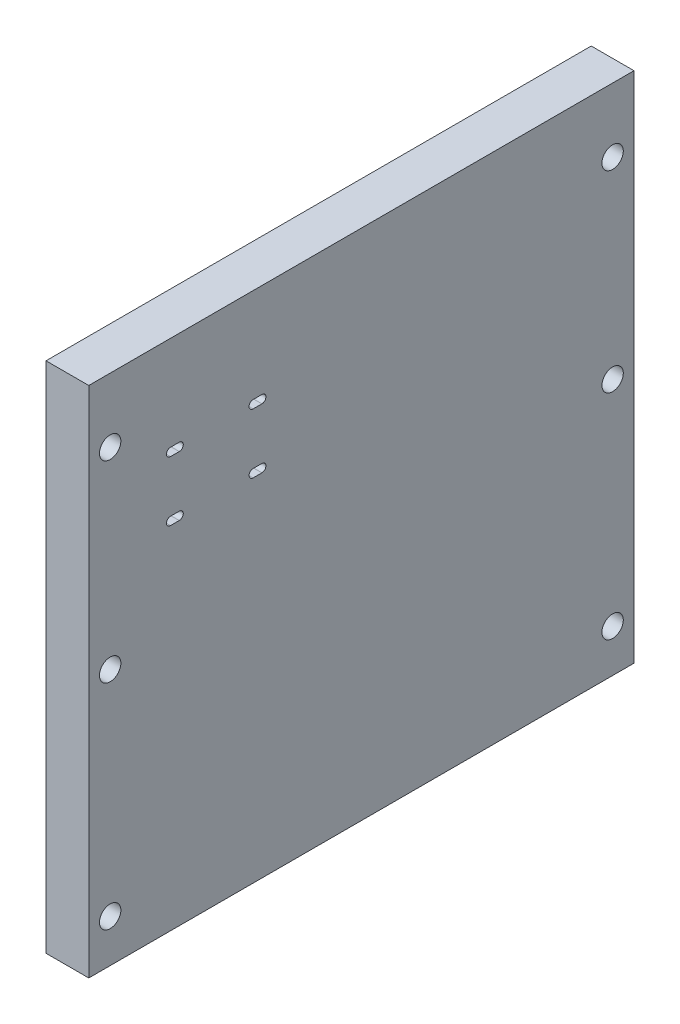
ISO-10303-21;
HEADER;
FILE_DESCRIPTION(('STEP AP214'),'2;1');
FILE_NAME('part.step','',(''),(''),'','','');
FILE_SCHEMA(('AUTOMOTIVE_DESIGN { 1 0 10303 214 1 1 1 1 }'));
ENDSEC;
DATA;
#1=APPLICATION_CONTEXT('core data for automotive mechanical design processes');
#2=APPLICATION_PROTOCOL_DEFINITION('international standard','automotive_design',2000,#1);
#3=PRODUCT_CONTEXT('',#1,'mechanical');
#4=PRODUCT('Part','Part','',(#3));
#5=PRODUCT_RELATED_PRODUCT_CATEGORY('part','',(#4));
#6=PRODUCT_DEFINITION_FORMATION('','',#4);
#7=PRODUCT_DEFINITION_CONTEXT('part definition',#1,'design');
#8=PRODUCT_DEFINITION('design','',#6,#7);
#9=PRODUCT_DEFINITION_SHAPE('','',#8);
#10=(LENGTH_UNIT() NAMED_UNIT(*) SI_UNIT(.MILLI.,.METRE.));
#11=(NAMED_UNIT(*) PLANE_ANGLE_UNIT() SI_UNIT($,.RADIAN.));
#12=(NAMED_UNIT(*) SI_UNIT($,.STERADIAN.) SOLID_ANGLE_UNIT());
#13=UNCERTAINTY_MEASURE_WITH_UNIT(LENGTH_MEASURE(1.E-05),#10,'distance_accuracy_value','');
#14=(GEOMETRIC_REPRESENTATION_CONTEXT(3) GLOBAL_UNCERTAINTY_ASSIGNED_CONTEXT((#13)) GLOBAL_UNIT_ASSIGNED_CONTEXT((#10,
#11,#12)) REPRESENTATION_CONTEXT('',''));
#15=CARTESIAN_POINT('',(0.,0.,0.));
#16=DIRECTION('',(0.,0.,1.));
#17=DIRECTION('',(1.,0.,0.));
#18=AXIS2_PLACEMENT_3D('',#15,#16,#17);
#19=CARTESIAN_POINT('',(12.7,46.97,11.515));
#20=DIRECTION('',(-1.,0.,0.));
#21=DIRECTION('',(0.,0.,1.));
#22=AXIS2_PLACEMENT_3D('',#19,#20,#21);
#23=CYLINDRICAL_SURFACE('',#22,1.2);
#24=CARTESIAN_POINT('',(0.,46.97,11.515));
#25=DIRECTION('',(1.,0.,0.));
#26=DIRECTION('',(0.,0.,-1.));
#27=AXIS2_PLACEMENT_3D('',#24,#25,#26);
#28=CIRCLE('',#27,1.2);
#29=CARTESIAN_POINT('',(0.,48.17,11.515));
#30=VERTEX_POINT('',#29);
#31=CARTESIAN_POINT('',(0.,45.77,11.515));
#32=VERTEX_POINT('',#31);
#33=EDGE_CURVE('E309',#30,#32,#28,.T.);
#34=ORIENTED_EDGE('',*,*,#33,.F.);
#35=DIRECTION('',(-1.,0.,0.));
#36=VECTOR('',#35,1.);
#37=CARTESIAN_POINT('',(12.7,48.17,11.515));
#38=LINE('',#37,#36);
#39=CARTESIAN_POINT('',(12.7,48.17,11.515));
#40=VERTEX_POINT('',#39);
#41=EDGE_CURVE('E11',#40,#30,#38,.T.);
#42=ORIENTED_EDGE('',*,*,#41,.F.);
#43=CARTESIAN_POINT('',(12.7,46.97,11.515));
#44=DIRECTION('',(1.,0.,0.));
#45=DIRECTION('',(0.,0.,-1.));
#46=AXIS2_PLACEMENT_3D('',#43,#44,#45);
#47=CIRCLE('',#46,1.2);
#48=CARTESIAN_POINT('',(12.7,45.77,11.515));
#49=VERTEX_POINT('',#48);
#50=EDGE_CURVE('E212',#40,#49,#47,.T.);
#51=ORIENTED_EDGE('',*,*,#50,.T.);
#52=DIRECTION('',(-1.,0.,0.));
#53=VECTOR('',#52,1.);
#54=CARTESIAN_POINT('',(12.7,45.77,11.515));
#55=LINE('',#54,#53);
#56=EDGE_CURVE('E139',#49,#32,#55,.T.);
#57=ORIENTED_EDGE('',*,*,#56,.T.);
#58=EDGE_LOOP('',(#34,#42,#51,#57));
#59=FACE_BOUND('',#58,.T.);
#60=ADVANCED_FACE('F49',(#59),#23,.F.);
#61=CARTESIAN_POINT('',(12.7,48.17,0.));
#62=DIRECTION('',(0.,-1.,0.));
#63=DIRECTION('',(0.,0.,-1.));
#64=AXIS2_PLACEMENT_3D('',#61,#62,#63);
#65=PLANE('',#64);
#66=DIRECTION('',(0.,0.,1.));
#67=VECTOR('',#66,1.);
#68=CARTESIAN_POINT('',(0.,48.17,0.));
#69=LINE('',#68,#67);
#70=CARTESIAN_POINT('',(0.,48.17,8.91500000000001));
#71=VERTEX_POINT('',#70);
#72=EDGE_CURVE('E203',#71,#30,#69,.T.);
#73=ORIENTED_EDGE('',*,*,#72,.F.);
#74=DIRECTION('',(-1.,0.,0.));
#75=VECTOR('',#74,1.);
#76=CARTESIAN_POINT('',(12.7,48.17,8.91500000000001));
#77=LINE('',#76,#75);
#78=CARTESIAN_POINT('',(12.7,48.17,8.91500000000001));
#79=VERTEX_POINT('',#78);
#80=EDGE_CURVE('E60',#79,#71,#77,.T.);
#81=ORIENTED_EDGE('',*,*,#80,.F.);
#82=DIRECTION('',(0.,0.,1.));
#83=VECTOR('',#82,1.);
#84=CARTESIAN_POINT('',(12.7,48.17,0.));
#85=LINE('',#84,#83);
#86=EDGE_CURVE('E201',#79,#40,#85,.T.);
#87=ORIENTED_EDGE('',*,*,#86,.T.);
#88=ORIENTED_EDGE('',*,*,#41,.T.);
#89=EDGE_LOOP('',(#73,#81,#87,#88));
#90=FACE_BOUND('',#89,.T.);
#91=ADVANCED_FACE('F200',(#90),#65,.T.);
#92=CARTESIAN_POINT('',(12.7,46.97,8.91500000000001));
#93=DIRECTION('',(-1.,0.,0.));
#94=DIRECTION('',(0.,0.,1.));
#95=AXIS2_PLACEMENT_3D('',#92,#93,#94);
#96=CYLINDRICAL_SURFACE('',#95,1.2);
#97=CARTESIAN_POINT('',(0.,46.97,8.91500000000001));
#98=DIRECTION('',(1.,0.,0.));
#99=DIRECTION('',(0.,0.,-1.));
#100=AXIS2_PLACEMENT_3D('',#97,#98,#99);
#101=CIRCLE('',#100,1.2);
#102=CARTESIAN_POINT('',(0.,45.77,8.91500000000001));
#103=VERTEX_POINT('',#102);
#104=EDGE_CURVE('E315',#103,#71,#101,.T.);
#105=ORIENTED_EDGE('',*,*,#104,.F.);
#106=DIRECTION('',(-1.,0.,0.));
#107=VECTOR('',#106,1.);
#108=CARTESIAN_POINT('',(12.7,45.77,8.91500000000001));
#109=LINE('',#108,#107);
#110=CARTESIAN_POINT('',(12.7,45.77,8.91500000000001));
#111=VERTEX_POINT('',#110);
#112=EDGE_CURVE('E132',#111,#103,#109,.T.);
#113=ORIENTED_EDGE('',*,*,#112,.F.);
#114=CARTESIAN_POINT('',(12.7,46.97,8.91500000000001));
#115=DIRECTION('',(1.,0.,0.));
#116=DIRECTION('',(0.,0.,-1.));
#117=AXIS2_PLACEMENT_3D('',#114,#115,#116);
#118=CIRCLE('',#117,1.2);
#119=EDGE_CURVE('E211',#111,#79,#118,.T.);
#120=ORIENTED_EDGE('',*,*,#119,.T.);
#121=ORIENTED_EDGE('',*,*,#80,.T.);
#122=EDGE_LOOP('',(#105,#113,#120,#121));
#123=FACE_BOUND('',#122,.T.);
#124=ADVANCED_FACE('F215',(#123),#96,.F.);
#125=CARTESIAN_POINT('',(12.7,30.43,0.));
#126=DIRECTION('',(0.,-1.,0.));
#127=DIRECTION('',(0.,0.,-1.));
#128=AXIS2_PLACEMENT_3D('',#125,#126,#127);
#129=PLANE('',#128);
#130=DIRECTION('',(0.,0.,1.));
#131=VECTOR('',#130,1.);
#132=CARTESIAN_POINT('',(0.,30.43,0.));
#133=LINE('',#132,#131);
#134=CARTESIAN_POINT('',(0.,30.43,8.91500000000001));
#135=VERTEX_POINT('',#134);
#136=CARTESIAN_POINT('',(0.,30.43,11.515));
#137=VERTEX_POINT('',#136);
#138=EDGE_CURVE('E293',#135,#137,#133,.T.);
#139=ORIENTED_EDGE('',*,*,#138,.F.);
#140=DIRECTION('',(-1.,0.,0.));
#141=VECTOR('',#140,1.);
#142=CARTESIAN_POINT('',(12.7,30.43,8.91500000000001));
#143=LINE('',#142,#141);
#144=CARTESIAN_POINT('',(12.7,30.43,8.91500000000001));
#145=VERTEX_POINT('',#144);
#146=EDGE_CURVE('E323',#145,#135,#143,.T.);
#147=ORIENTED_EDGE('',*,*,#146,.F.);
#148=DIRECTION('',(0.,0.,1.));
#149=VECTOR('',#148,1.);
#150=CARTESIAN_POINT('',(12.7,30.43,0.));
#151=LINE('',#150,#149);
#152=CARTESIAN_POINT('',(12.7,30.43,11.515));
#153=VERTEX_POINT('',#152);
#154=EDGE_CURVE('E456',#145,#153,#151,.T.);
#155=ORIENTED_EDGE('',*,*,#154,.T.);
#156=DIRECTION('',(-1.,0.,0.));
#157=VECTOR('',#156,1.);
#158=CARTESIAN_POINT('',(12.7,30.43,11.515));
#159=LINE('',#158,#157);
#160=EDGE_CURVE('E326',#153,#137,#159,.T.);
#161=ORIENTED_EDGE('',*,*,#160,.T.);
#162=EDGE_LOOP('',(#139,#147,#155,#161));
#163=FACE_BOUND('',#162,.T.);
#164=ADVANCED_FACE('F505',(#163),#129,.T.);
#165=CARTESIAN_POINT('',(12.7,29.23,8.91500000000001));
#166=DIRECTION('',(-1.,0.,0.));
#167=DIRECTION('',(0.,0.,1.));
#168=AXIS2_PLACEMENT_3D('',#165,#166,#167);
#169=CYLINDRICAL_SURFACE('',#168,1.2);
#170=CARTESIAN_POINT('',(0.,29.23,8.91500000000001));
#171=DIRECTION('',(1.,0.,0.));
#172=DIRECTION('',(0.,0.,-1.));
#173=AXIS2_PLACEMENT_3D('',#170,#171,#172);
#174=CIRCLE('',#173,1.2);
#175=CARTESIAN_POINT('',(0.,28.03,8.91500000000001));
#176=VERTEX_POINT('',#175);
#177=EDGE_CURVE('E297',#135,#176,#174,.F.);
#178=ORIENTED_EDGE('',*,*,#177,.T.);
#179=DIRECTION('',(-1.,0.,0.));
#180=VECTOR('',#179,1.);
#181=CARTESIAN_POINT('',(12.7,28.03,8.91500000000001));
#182=LINE('',#181,#180);
#183=CARTESIAN_POINT('',(12.7,28.03,8.91500000000001));
#184=VERTEX_POINT('',#183);
#185=EDGE_CURVE('E334',#184,#176,#182,.T.);
#186=ORIENTED_EDGE('',*,*,#185,.F.);
#187=CARTESIAN_POINT('',(12.7,29.23,8.91500000000001));
#188=DIRECTION('',(1.,0.,0.));
#189=DIRECTION('',(0.,0.,-1.));
#190=AXIS2_PLACEMENT_3D('',#187,#188,#189);
#191=CIRCLE('',#190,1.2);
#192=EDGE_CURVE('E460',#145,#184,#191,.F.);
#193=ORIENTED_EDGE('',*,*,#192,.F.);
#194=ORIENTED_EDGE('',*,*,#146,.T.);
#195=EDGE_LOOP('',(#178,#186,#193,#194));
#196=FACE_BOUND('',#195,.T.);
#197=ADVANCED_FACE('F501',(#196),#169,.F.);
#198=CARTESIAN_POINT('',(12.7,28.03,0.));
#199=DIRECTION('',(0.,-1.,0.));
#200=DIRECTION('',(0.,0.,-1.));
#201=AXIS2_PLACEMENT_3D('',#198,#199,#200);
#202=PLANE('',#201);
#203=DIRECTION('',(0.,0.,1.));
#204=VECTOR('',#203,1.);
#205=CARTESIAN_POINT('',(0.,28.03,0.));
#206=LINE('',#205,#204);
#207=CARTESIAN_POINT('',(0.,28.03,11.515));
#208=VERTEX_POINT('',#207);
#209=EDGE_CURVE('E301',#176,#208,#206,.T.);
#210=ORIENTED_EDGE('',*,*,#209,.T.);
#211=DIRECTION('',(-1.,0.,0.));
#212=VECTOR('',#211,1.);
#213=CARTESIAN_POINT('',(12.7,28.03,11.515));
#214=LINE('',#213,#212);
#215=CARTESIAN_POINT('',(12.7,28.03,11.515));
#216=VERTEX_POINT('',#215);
#217=EDGE_CURVE('E329',#216,#208,#214,.T.);
#218=ORIENTED_EDGE('',*,*,#217,.F.);
#219=DIRECTION('',(0.,0.,1.));
#220=VECTOR('',#219,1.);
#221=CARTESIAN_POINT('',(12.7,28.03,0.));
#222=LINE('',#221,#220);
#223=EDGE_CURVE('E464',#184,#216,#222,.T.);
#224=ORIENTED_EDGE('',*,*,#223,.F.);
#225=ORIENTED_EDGE('',*,*,#185,.T.);
#226=EDGE_LOOP('',(#210,#218,#224,#225));
#227=FACE_BOUND('',#226,.T.);
#228=ADVANCED_FACE('F497',(#227),#202,.F.);
#229=CARTESIAN_POINT('',(12.7,45.77,0.));
#230=DIRECTION('',(0.,1.,0.));
#231=DIRECTION('',(0.,0.,1.));
#232=AXIS2_PLACEMENT_3D('',#229,#230,#231);
#233=PLANE('',#232);
#234=DIRECTION('',(0.,0.,-1.));
#235=VECTOR('',#234,1.);
#236=CARTESIAN_POINT('',(0.,45.77,0.));
#237=LINE('',#236,#235);
#238=CARTESIAN_POINT('',(0.,45.77,36.055));
#239=VERTEX_POINT('',#238);
#240=CARTESIAN_POINT('',(0.,45.77,33.455));
#241=VERTEX_POINT('',#240);
#242=EDGE_CURVE('E277',#239,#241,#237,.T.);
#243=ORIENTED_EDGE('',*,*,#242,.F.);
#244=DIRECTION('',(-1.,0.,0.));
#245=VECTOR('',#244,1.);
#246=CARTESIAN_POINT('',(12.7,45.77,36.055));
#247=LINE('',#246,#245);
#248=CARTESIAN_POINT('',(12.7,45.77,36.055));
#249=VERTEX_POINT('',#248);
#250=EDGE_CURVE('E330',#249,#239,#247,.T.);
#251=ORIENTED_EDGE('',*,*,#250,.F.);
#252=DIRECTION('',(0.,0.,-1.));
#253=VECTOR('',#252,1.);
#254=CARTESIAN_POINT('',(12.7,45.77,0.));
#255=LINE('',#254,#253);
#256=CARTESIAN_POINT('',(12.7,45.77,33.455));
#257=VERTEX_POINT('',#256);
#258=EDGE_CURVE('E441',#249,#257,#255,.T.);
#259=ORIENTED_EDGE('',*,*,#258,.T.);
#260=DIRECTION('',(-1.,0.,0.));
#261=VECTOR('',#260,1.);
#262=CARTESIAN_POINT('',(12.7,45.77,33.455));
#263=LINE('',#262,#261);
#264=EDGE_CURVE('E340',#257,#241,#263,.T.);
#265=ORIENTED_EDGE('',*,*,#264,.T.);
#266=EDGE_LOOP('',(#243,#251,#259,#265));
#267=FACE_BOUND('',#266,.T.);
#268=ADVANCED_FACE('F500',(#267),#233,.T.);
#269=CARTESIAN_POINT('',(12.7,46.97,36.055));
#270=DIRECTION('',(-1.,0.,0.));
#271=DIRECTION('',(0.,0.,1.));
#272=AXIS2_PLACEMENT_3D('',#269,#270,#271);
#273=CYLINDRICAL_SURFACE('',#272,1.2);
#274=CARTESIAN_POINT('',(0.,46.97,36.055));
#275=DIRECTION('',(1.,0.,0.));
#276=DIRECTION('',(0.,0.,-1.));
#277=AXIS2_PLACEMENT_3D('',#274,#275,#276);
#278=CIRCLE('',#277,1.2);
#279=CARTESIAN_POINT('',(0.,48.17,36.055));
#280=VERTEX_POINT('',#279);
#281=EDGE_CURVE('E281',#239,#280,#278,.F.);
#282=ORIENTED_EDGE('',*,*,#281,.T.);
#283=DIRECTION('',(-1.,0.,0.));
#284=VECTOR('',#283,1.);
#285=CARTESIAN_POINT('',(12.7,48.17,36.055));
#286=LINE('',#285,#284);
#287=CARTESIAN_POINT('',(12.7,48.17,36.055));
#288=VERTEX_POINT('',#287);
#289=EDGE_CURVE('E348',#288,#280,#286,.T.);
#290=ORIENTED_EDGE('',*,*,#289,.F.);
#291=CARTESIAN_POINT('',(12.7,46.97,36.055));
#292=DIRECTION('',(1.,0.,0.));
#293=DIRECTION('',(0.,0.,-1.));
#294=AXIS2_PLACEMENT_3D('',#291,#292,#293);
#295=CIRCLE('',#294,1.2);
#296=EDGE_CURVE('E445',#249,#288,#295,.F.);
#297=ORIENTED_EDGE('',*,*,#296,.F.);
#298=ORIENTED_EDGE('',*,*,#250,.T.);
#299=EDGE_LOOP('',(#282,#290,#297,#298));
#300=FACE_BOUND('',#299,.T.);
#301=ADVANCED_FACE('F518',(#300),#273,.F.);
#302=CARTESIAN_POINT('',(12.7,48.17,0.));
#303=DIRECTION('',(0.,1.,0.));
#304=DIRECTION('',(0.,0.,1.));
#305=AXIS2_PLACEMENT_3D('',#302,#303,#304);
#306=PLANE('',#305);
#307=DIRECTION('',(0.,0.,-1.));
#308=VECTOR('',#307,1.);
#309=CARTESIAN_POINT('',(0.,48.17,0.));
#310=LINE('',#309,#308);
#311=CARTESIAN_POINT('',(0.,48.17,33.455));
#312=VERTEX_POINT('',#311);
#313=EDGE_CURVE('E285',#280,#312,#310,.T.);
#314=ORIENTED_EDGE('',*,*,#313,.T.);
#315=DIRECTION('',(-1.,0.,0.));
#316=VECTOR('',#315,1.);
#317=CARTESIAN_POINT('',(12.7,48.17,33.455));
#318=LINE('',#317,#316);
#319=CARTESIAN_POINT('',(12.7,48.17,33.455));
#320=VERTEX_POINT('',#319);
#321=EDGE_CURVE('E343',#320,#312,#318,.T.);
#322=ORIENTED_EDGE('',*,*,#321,.F.);
#323=DIRECTION('',(0.,0.,-1.));
#324=VECTOR('',#323,1.);
#325=CARTESIAN_POINT('',(12.7,48.17,0.));
#326=LINE('',#325,#324);
#327=EDGE_CURVE('E449',#288,#320,#326,.T.);
#328=ORIENTED_EDGE('',*,*,#327,.F.);
#329=ORIENTED_EDGE('',*,*,#289,.T.);
#330=EDGE_LOOP('',(#314,#322,#328,#329));
#331=FACE_BOUND('',#330,.T.);
#332=ADVANCED_FACE('F514',(#331),#306,.F.);
#333=CARTESIAN_POINT('',(12.7,29.23,33.455));
#334=DIRECTION('',(-1.,0.,0.));
#335=DIRECTION('',(0.,0.,1.));
#336=AXIS2_PLACEMENT_3D('',#333,#334,#335);
#337=CYLINDRICAL_SURFACE('',#336,1.2);
#338=CARTESIAN_POINT('',(0.,29.23,33.455));
#339=DIRECTION('',(1.,0.,0.));
#340=DIRECTION('',(0.,0.,-1.));
#341=AXIS2_PLACEMENT_3D('',#338,#339,#340);
#342=CIRCLE('',#341,1.2);
#343=CARTESIAN_POINT('',(0.,28.03,33.455));
#344=VERTEX_POINT('',#343);
#345=CARTESIAN_POINT('',(0.,30.43,33.455));
#346=VERTEX_POINT('',#345);
#347=EDGE_CURVE('E261',#344,#346,#342,.T.);
#348=ORIENTED_EDGE('',*,*,#347,.F.);
#349=DIRECTION('',(-1.,0.,0.));
#350=VECTOR('',#349,1.);
#351=CARTESIAN_POINT('',(12.7,28.03,33.455));
#352=LINE('',#351,#350);
#353=CARTESIAN_POINT('',(12.7,28.03,33.455));
#354=VERTEX_POINT('',#353);
#355=EDGE_CURVE('E344',#354,#344,#352,.T.);
#356=ORIENTED_EDGE('',*,*,#355,.F.);
#357=CARTESIAN_POINT('',(12.7,29.23,33.455));
#358=DIRECTION('',(1.,0.,0.));
#359=DIRECTION('',(0.,0.,-1.));
#360=AXIS2_PLACEMENT_3D('',#357,#358,#359);
#361=CIRCLE('',#360,1.2);
#362=CARTESIAN_POINT('',(12.7,30.43,33.455));
#363=VERTEX_POINT('',#362);
#364=EDGE_CURVE('E426',#354,#363,#361,.T.);
#365=ORIENTED_EDGE('',*,*,#364,.T.);
#366=DIRECTION('',(-1.,0.,0.));
#367=VECTOR('',#366,1.);
#368=CARTESIAN_POINT('',(12.7,30.43,33.455));
#369=LINE('',#368,#367);
#370=EDGE_CURVE('E354',#363,#346,#369,.T.);
#371=ORIENTED_EDGE('',*,*,#370,.T.);
#372=EDGE_LOOP('',(#348,#356,#365,#371));
#373=FACE_BOUND('',#372,.T.);
#374=ADVANCED_FACE('F517',(#373),#337,.F.);
#375=CARTESIAN_POINT('',(12.7,28.03,0.));
#376=DIRECTION('',(0.,1.,0.));
#377=DIRECTION('',(0.,0.,1.));
#378=AXIS2_PLACEMENT_3D('',#375,#376,#377);
#379=PLANE('',#378);
#380=DIRECTION('',(0.,0.,-1.));
#381=VECTOR('',#380,1.);
#382=CARTESIAN_POINT('',(0.,28.03,0.));
#383=LINE('',#382,#381);
#384=CARTESIAN_POINT('',(0.,28.03,36.055));
#385=VERTEX_POINT('',#384);
#386=EDGE_CURVE('E265',#385,#344,#383,.T.);
#387=ORIENTED_EDGE('',*,*,#386,.F.);
#388=DIRECTION('',(-1.,0.,0.));
#389=VECTOR('',#388,1.);
#390=CARTESIAN_POINT('',(12.7,28.03,36.055));
#391=LINE('',#390,#389);
#392=CARTESIAN_POINT('',(12.7,28.03,36.055));
#393=VERTEX_POINT('',#392);
#394=EDGE_CURVE('E360',#393,#385,#391,.T.);
#395=ORIENTED_EDGE('',*,*,#394,.F.);
#396=DIRECTION('',(0.,0.,-1.));
#397=VECTOR('',#396,1.);
#398=CARTESIAN_POINT('',(12.7,28.03,0.));
#399=LINE('',#398,#397);
#400=EDGE_CURVE('E430',#393,#354,#399,.T.);
#401=ORIENTED_EDGE('',*,*,#400,.T.);
#402=ORIENTED_EDGE('',*,*,#355,.T.);
#403=EDGE_LOOP('',(#387,#395,#401,#402));
#404=FACE_BOUND('',#403,.T.);
#405=ADVANCED_FACE('F533',(#404),#379,.T.);
#406=CARTESIAN_POINT('',(12.7,29.23,36.055));
#407=DIRECTION('',(-1.,0.,0.));
#408=DIRECTION('',(0.,0.,1.));
#409=AXIS2_PLACEMENT_3D('',#406,#407,#408);
#410=CYLINDRICAL_SURFACE('',#409,1.2);
#411=CARTESIAN_POINT('',(0.,29.23,36.055));
#412=DIRECTION('',(1.,0.,0.));
#413=DIRECTION('',(0.,0.,-1.));
#414=AXIS2_PLACEMENT_3D('',#411,#412,#413);
#415=CIRCLE('',#414,1.2);
#416=CARTESIAN_POINT('',(0.,30.43,36.055));
#417=VERTEX_POINT('',#416);
#418=EDGE_CURVE('E269',#417,#385,#415,.T.);
#419=ORIENTED_EDGE('',*,*,#418,.F.);
#420=DIRECTION('',(-1.,0.,0.));
#421=VECTOR('',#420,1.);
#422=CARTESIAN_POINT('',(12.7,30.43,36.055));
#423=LINE('',#422,#421);
#424=CARTESIAN_POINT('',(12.7,30.43,36.055));
#425=VERTEX_POINT('',#424);
#426=EDGE_CURVE('E357',#425,#417,#423,.T.);
#427=ORIENTED_EDGE('',*,*,#426,.F.);
#428=CARTESIAN_POINT('',(12.7,29.23,36.055));
#429=DIRECTION('',(1.,0.,0.));
#430=DIRECTION('',(0.,0.,-1.));
#431=AXIS2_PLACEMENT_3D('',#428,#429,#430);
#432=CIRCLE('',#431,1.2);
#433=EDGE_CURVE('E434',#425,#393,#432,.T.);
#434=ORIENTED_EDGE('',*,*,#433,.T.);
#435=ORIENTED_EDGE('',*,*,#394,.T.);
#436=EDGE_LOOP('',(#419,#427,#434,#435));
#437=FACE_BOUND('',#436,.T.);
#438=ADVANCED_FACE('F530',(#437),#410,.F.);
#439=CARTESIAN_POINT('',(12.7,0.,-101.6));
#440=DIRECTION('',(0.,0.,1.));
#441=DIRECTION('',(1.,0.,0.));
#442=AXIS2_PLACEMENT_3D('',#439,#440,#441);
#443=PLANE('',#442);
#444=DIRECTION('',(0.,1.,0.));
#445=VECTOR('',#444,1.);
#446=CARTESIAN_POINT('',(0.,0.,-101.6));
#447=LINE('',#446,#445);
#448=CARTESIAN_POINT('',(0.,-76.2,-101.6));
#449=VERTEX_POINT('',#448);
#450=CARTESIAN_POINT('',(0.,76.2,-101.6));
#451=VERTEX_POINT('',#450);
#452=EDGE_CURVE('E223',#449,#451,#447,.T.);
#453=ORIENTED_EDGE('',*,*,#452,.T.);
#454=DIRECTION('',(-1.,0.,0.));
#455=VECTOR('',#454,1.);
#456=CARTESIAN_POINT('',(12.7,76.2,-101.6));
#457=LINE('',#456,#455);
#458=CARTESIAN_POINT('',(12.7,76.2,-101.6));
#459=VERTEX_POINT('',#458);
#460=EDGE_CURVE('E53',#459,#451,#457,.T.);
#461=ORIENTED_EDGE('',*,*,#460,.F.);
#462=DIRECTION('',(0.,1.,0.));
#463=VECTOR('',#462,1.);
#464=CARTESIAN_POINT('',(12.7,0.,-101.6));
#465=LINE('',#464,#463);
#466=CARTESIAN_POINT('',(12.7,-76.2,-101.6));
#467=VERTEX_POINT('',#466);
#468=EDGE_CURVE('E147',#467,#459,#465,.T.);
#469=ORIENTED_EDGE('',*,*,#468,.F.);
#470=DIRECTION('',(-1.,0.,0.));
#471=VECTOR('',#470,1.);
#472=CARTESIAN_POINT('',(12.7,-76.2,-101.6));
#473=LINE('',#472,#471);
#474=EDGE_CURVE('E219',#467,#449,#473,.T.);
#475=ORIENTED_EDGE('',*,*,#474,.T.);
#476=EDGE_LOOP('',(#453,#461,#469,#475));
#477=FACE_BOUND('',#476,.T.);
#478=ADVANCED_FACE('F51',(#477),#443,.F.);
#479=CARTESIAN_POINT('',(12.7,76.2,0.));
#480=DIRECTION('',(0.,1.,0.));
#481=DIRECTION('',(0.,0.,1.));
#482=AXIS2_PLACEMENT_3D('',#479,#480,#481);
#483=PLANE('',#482);
#484=DIRECTION('',(0.,0.,-1.));
#485=VECTOR('',#484,1.);
#486=CARTESIAN_POINT('',(0.,76.2,0.));
#487=LINE('',#486,#485);
#488=CARTESIAN_POINT('',(0.,76.2,60.325));
#489=VERTEX_POINT('',#488);
#490=EDGE_CURVE('E227',#489,#451,#487,.T.);
#491=ORIENTED_EDGE('',*,*,#490,.F.);
#492=DIRECTION('',(-1.,0.,0.));
#493=VECTOR('',#492,1.);
#494=CARTESIAN_POINT('',(12.7,76.2,60.325));
#495=LINE('',#494,#493);
#496=CARTESIAN_POINT('',(12.7,76.2,60.325));
#497=VERTEX_POINT('',#496);
#498=EDGE_CURVE('E371',#497,#489,#495,.T.);
#499=ORIENTED_EDGE('',*,*,#498,.F.);
#500=DIRECTION('',(0.,0.,-1.));
#501=VECTOR('',#500,1.);
#502=CARTESIAN_POINT('',(12.7,76.2,0.));
#503=LINE('',#502,#501);
#504=EDGE_CURVE('E381',#497,#459,#503,.T.);
#505=ORIENTED_EDGE('',*,*,#504,.T.);
#506=ORIENTED_EDGE('',*,*,#460,.T.);
#507=EDGE_LOOP('',(#491,#499,#505,#506));
#508=FACE_BOUND('',#507,.T.);
#509=ADVANCED_FACE('F380',(#508),#483,.T.);
#510=CARTESIAN_POINT('',(12.7,0.,60.325));
#511=DIRECTION('',(0.,0.,-1.));
#512=DIRECTION('',(0.,1.,0.));
#513=AXIS2_PLACEMENT_3D('',#510,#511,#512);
#514=PLANE('',#513);
#515=DIRECTION('',(0.,-1.,0.));
#516=VECTOR('',#515,1.);
#517=CARTESIAN_POINT('',(0.,0.,60.325));
#518=LINE('',#517,#516);
#519=CARTESIAN_POINT('',(0.,-76.2,60.325));
#520=VERTEX_POINT('',#519);
#521=EDGE_CURVE('E231',#489,#520,#518,.T.);
#522=ORIENTED_EDGE('',*,*,#521,.T.);
#523=DIRECTION('',(-1.,0.,0.));
#524=VECTOR('',#523,1.);
#525=CARTESIAN_POINT('',(12.7,-76.2,60.325));
#526=LINE('',#525,#524);
#527=CARTESIAN_POINT('',(12.7,-76.2,60.325));
#528=VERTEX_POINT('',#527);
#529=EDGE_CURVE('E368',#528,#520,#526,.T.);
#530=ORIENTED_EDGE('',*,*,#529,.F.);
#531=DIRECTION('',(0.,-1.,0.));
#532=VECTOR('',#531,1.);
#533=CARTESIAN_POINT('',(12.7,0.,60.325));
#534=LINE('',#533,#532);
#535=EDGE_CURVE('E397',#497,#528,#534,.T.);
#536=ORIENTED_EDGE('',*,*,#535,.F.);
#537=ORIENTED_EDGE('',*,*,#498,.T.);
#538=EDGE_LOOP('',(#522,#530,#536,#537));
#539=FACE_BOUND('',#538,.T.);
#540=ADVANCED_FACE('F390',(#539),#514,.F.);
#541=CARTESIAN_POINT('',(12.7,29.23,11.515));
#542=DIRECTION('',(-1.,0.,0.));
#543=DIRECTION('',(0.,0.,1.));
#544=AXIS2_PLACEMENT_3D('',#541,#542,#543);
#545=CYLINDRICAL_SURFACE('',#544,1.2);
#546=CARTESIAN_POINT('',(0.,29.23,11.515));
#547=DIRECTION('',(1.,0.,0.));
#548=DIRECTION('',(0.,0.,-1.));
#549=AXIS2_PLACEMENT_3D('',#546,#547,#548);
#550=CIRCLE('',#549,1.2);
#551=EDGE_CURVE('E305',#208,#137,#550,.F.);
#552=ORIENTED_EDGE('',*,*,#551,.T.);
#553=ORIENTED_EDGE('',*,*,#160,.F.);
#554=CARTESIAN_POINT('',(12.7,29.23,11.515));
#555=DIRECTION('',(1.,0.,0.));
#556=DIRECTION('',(0.,0.,-1.));
#557=AXIS2_PLACEMENT_3D('',#554,#555,#556);
#558=CIRCLE('',#557,1.2);
#559=EDGE_CURVE('E468',#216,#153,#558,.F.);
#560=ORIENTED_EDGE('',*,*,#559,.F.);
#561=ORIENTED_EDGE('',*,*,#217,.T.);
#562=EDGE_LOOP('',(#552,#553,#560,#561));
#563=FACE_BOUND('',#562,.T.);
#564=ADVANCED_FACE('F492',(#563),#545,.F.);
#565=CARTESIAN_POINT('',(12.7,46.97,33.455));
#566=DIRECTION('',(-1.,0.,0.));
#567=DIRECTION('',(0.,0.,1.));
#568=AXIS2_PLACEMENT_3D('',#565,#566,#567);
#569=CYLINDRICAL_SURFACE('',#568,1.2);
#570=CARTESIAN_POINT('',(0.,46.97,33.455));
#571=DIRECTION('',(1.,0.,0.));
#572=DIRECTION('',(0.,0.,-1.));
#573=AXIS2_PLACEMENT_3D('',#570,#571,#572);
#574=CIRCLE('',#573,1.2);
#575=EDGE_CURVE('E289',#312,#241,#574,.F.);
#576=ORIENTED_EDGE('',*,*,#575,.T.);
#577=ORIENTED_EDGE('',*,*,#264,.F.);
#578=CARTESIAN_POINT('',(12.7,46.97,33.455));
#579=DIRECTION('',(1.,0.,0.));
#580=DIRECTION('',(0.,0.,-1.));
#581=AXIS2_PLACEMENT_3D('',#578,#579,#580);
#582=CIRCLE('',#581,1.2);
#583=EDGE_CURVE('E453',#320,#257,#582,.F.);
#584=ORIENTED_EDGE('',*,*,#583,.F.);
#585=ORIENTED_EDGE('',*,*,#321,.T.);
#586=EDGE_LOOP('',(#576,#577,#584,#585));
#587=FACE_BOUND('',#586,.T.);
#588=ADVANCED_FACE('F495',(#587),#569,.F.);
#589=CARTESIAN_POINT('',(12.7,30.43,0.));
#590=DIRECTION('',(0.,1.,0.));
#591=DIRECTION('',(0.,0.,1.));
#592=AXIS2_PLACEMENT_3D('',#589,#590,#591);
#593=PLANE('',#592);
#594=DIRECTION('',(0.,0.,-1.));
#595=VECTOR('',#594,1.);
#596=CARTESIAN_POINT('',(0.,30.43,0.));
#597=LINE('',#596,#595);
#598=EDGE_CURVE('E273',#417,#346,#597,.T.);
#599=ORIENTED_EDGE('',*,*,#598,.T.);
#600=ORIENTED_EDGE('',*,*,#370,.F.);
#601=DIRECTION('',(0.,0.,-1.));
#602=VECTOR('',#601,1.);
#603=CARTESIAN_POINT('',(12.7,30.43,0.));
#604=LINE('',#603,#602);
#605=EDGE_CURVE('E438',#425,#363,#604,.T.);
#606=ORIENTED_EDGE('',*,*,#605,.F.);
#607=ORIENTED_EDGE('',*,*,#426,.T.);
#608=EDGE_LOOP('',(#599,#600,#606,#607));
#609=FACE_BOUND('',#608,.T.);
#610=ADVANCED_FACE('F512',(#609),#593,.F.);
#611=CARTESIAN_POINT('',(12.7,-63.5,53.975));
#612=DIRECTION('',(-1.,0.,0.));
#613=DIRECTION('',(0.,0.,1.));
#614=AXIS2_PLACEMENT_3D('',#611,#612,#613);
#615=CYLINDRICAL_SURFACE('',#614,3.175);
#616=CARTESIAN_POINT('',(12.7,-63.5,53.975));
#617=DIRECTION('',(1.,0.,0.));
#618=DIRECTION('',(0.,0.,-1.));
#619=AXIS2_PLACEMENT_3D('',#616,#617,#618);
#620=CIRCLE('',#619,3.175);
#621=CARTESIAN_POINT('',(12.7,-63.5,50.8));
#622=VERTEX_POINT('',#621);
#623=EDGE_CURVE('E422',#622,#622,#620,.T.);
#624=ORIENTED_EDGE('',*,*,#623,.T.);
#625=EDGE_LOOP('',(#624));
#626=FACE_BOUND('',#625,.T.);
#627=CARTESIAN_POINT('',(0.,-63.5,53.975));
#628=DIRECTION('',(1.,0.,0.));
#629=DIRECTION('',(0.,0.,-1.));
#630=AXIS2_PLACEMENT_3D('',#627,#628,#629);
#631=CIRCLE('',#630,3.175);
#632=CARTESIAN_POINT('',(0.,-63.5,50.8));
#633=VERTEX_POINT('',#632);
#634=EDGE_CURVE('E257',#633,#633,#631,.T.);
#635=ORIENTED_EDGE('',*,*,#634,.F.);
#636=EDGE_LOOP('',(#635));
#637=FACE_BOUND('',#636,.T.);
#638=ADVANCED_FACE('F528',(#626,#637),#615,.F.);
#639=CARTESIAN_POINT('',(12.7,0.,53.975));
#640=DIRECTION('',(-1.,0.,0.));
#641=DIRECTION('',(0.,0.,1.));
#642=AXIS2_PLACEMENT_3D('',#639,#640,#641);
#643=CYLINDRICAL_SURFACE('',#642,3.175);
#644=CARTESIAN_POINT('',(12.7,0.,53.975));
#645=DIRECTION('',(1.,0.,0.));
#646=DIRECTION('',(0.,0.,-1.));
#647=AXIS2_PLACEMENT_3D('',#644,#645,#646);
#648=CIRCLE('',#647,3.175);
#649=CARTESIAN_POINT('',(12.7,0.,50.8));
#650=VERTEX_POINT('',#649);
#651=EDGE_CURVE('E418',#650,#650,#648,.T.);
#652=ORIENTED_EDGE('',*,*,#651,.T.);
#653=EDGE_LOOP('',(#652));
#654=FACE_BOUND('',#653,.T.);
#655=CARTESIAN_POINT('',(0.,0.,53.975));
#656=DIRECTION('',(1.,0.,0.));
#657=DIRECTION('',(0.,0.,-1.));
#658=AXIS2_PLACEMENT_3D('',#655,#656,#657);
#659=CIRCLE('',#658,3.175);
#660=CARTESIAN_POINT('',(0.,0.,50.8));
#661=VERTEX_POINT('',#660);
#662=EDGE_CURVE('E253',#661,#661,#659,.T.);
#663=ORIENTED_EDGE('',*,*,#662,.F.);
#664=EDGE_LOOP('',(#663));
#665=FACE_BOUND('',#664,.T.);
#666=ADVANCED_FACE('F543',(#654,#665),#643,.F.);
#667=CARTESIAN_POINT('',(12.7,57.15,53.9750000000001));
#668=DIRECTION('',(-1.,0.,0.));
#669=DIRECTION('',(0.,0.,1.));
#670=AXIS2_PLACEMENT_3D('',#667,#668,#669);
#671=CYLINDRICAL_SURFACE('',#670,3.175);
#672=CARTESIAN_POINT('',(12.7,57.15,53.9750000000001));
#673=DIRECTION('',(1.,0.,0.));
#674=DIRECTION('',(0.,0.,-1.));
#675=AXIS2_PLACEMENT_3D('',#672,#673,#674);
#676=CIRCLE('',#675,3.175);
#677=CARTESIAN_POINT('',(12.7,57.15,50.8000000000001));
#678=VERTEX_POINT('',#677);
#679=EDGE_CURVE('E414',#678,#678,#676,.T.);
#680=ORIENTED_EDGE('',*,*,#679,.T.);
#681=EDGE_LOOP('',(#680));
#682=FACE_BOUND('',#681,.T.);
#683=CARTESIAN_POINT('',(0.,57.15,53.9750000000001));
#684=DIRECTION('',(1.,0.,0.));
#685=DIRECTION('',(0.,0.,-1.));
#686=AXIS2_PLACEMENT_3D('',#683,#684,#685);
#687=CIRCLE('',#686,3.175);
#688=CARTESIAN_POINT('',(0.,57.15,50.8000000000001));
#689=VERTEX_POINT('',#688);
#690=EDGE_CURVE('E249',#689,#689,#687,.T.);
#691=ORIENTED_EDGE('',*,*,#690,.F.);
#692=EDGE_LOOP('',(#691));
#693=FACE_BOUND('',#692,.T.);
#694=ADVANCED_FACE('F547',(#682,#693),#671,.F.);
#695=CARTESIAN_POINT('',(12.7,0.,-95.25));
#696=DIRECTION('',(-1.,0.,0.));
#697=DIRECTION('',(0.,0.,1.));
#698=AXIS2_PLACEMENT_3D('',#695,#696,#697);
#699=CYLINDRICAL_SURFACE('',#698,3.175);
#700=CARTESIAN_POINT('',(12.7,0.,-95.25));
#701=DIRECTION('',(1.,0.,0.));
#702=DIRECTION('',(0.,0.,-1.));
#703=AXIS2_PLACEMENT_3D('',#700,#701,#702);
#704=CIRCLE('',#703,3.175);
#705=CARTESIAN_POINT('',(12.7,0.,-98.425));
#706=VERTEX_POINT('',#705);
#707=EDGE_CURVE('E410',#706,#706,#704,.T.);
#708=ORIENTED_EDGE('',*,*,#707,.T.);
#709=EDGE_LOOP('',(#708));
#710=FACE_BOUND('',#709,.T.);
#711=CARTESIAN_POINT('',(0.,0.,-95.25));
#712=DIRECTION('',(1.,0.,0.));
#713=DIRECTION('',(0.,0.,-1.));
#714=AXIS2_PLACEMENT_3D('',#711,#712,#713);
#715=CIRCLE('',#714,3.175);
#716=CARTESIAN_POINT('',(0.,0.,-98.425));
#717=VERTEX_POINT('',#716);
#718=EDGE_CURVE('E245',#717,#717,#715,.T.);
#719=ORIENTED_EDGE('',*,*,#718,.F.);
#720=EDGE_LOOP('',(#719));
#721=FACE_BOUND('',#720,.T.);
#722=ADVANCED_FACE('F551',(#710,#721),#699,.F.);
#723=CARTESIAN_POINT('',(12.7,-63.5,-95.25));
#724=DIRECTION('',(-1.,0.,0.));
#725=DIRECTION('',(0.,0.,1.));
#726=AXIS2_PLACEMENT_3D('',#723,#724,#725);
#727=CYLINDRICAL_SURFACE('',#726,3.175);
#728=CARTESIAN_POINT('',(12.7,-63.5,-95.25));
#729=DIRECTION('',(1.,0.,0.));
#730=DIRECTION('',(0.,0.,-1.));
#731=AXIS2_PLACEMENT_3D('',#728,#729,#730);
#732=CIRCLE('',#731,3.175);
#733=CARTESIAN_POINT('',(12.7,-63.5,-98.425));
#734=VERTEX_POINT('',#733);
#735=EDGE_CURVE('E402',#734,#734,#732,.T.);
#736=ORIENTED_EDGE('',*,*,#735,.T.);
#737=EDGE_LOOP('',(#736));
#738=FACE_BOUND('',#737,.T.);
#739=CARTESIAN_POINT('',(0.,-63.5,-95.25));
#740=DIRECTION('',(1.,0.,0.));
#741=DIRECTION('',(0.,0.,-1.));
#742=AXIS2_PLACEMENT_3D('',#739,#740,#741);
#743=CIRCLE('',#742,3.175);
#744=CARTESIAN_POINT('',(0.,-63.5,-98.425));
#745=VERTEX_POINT('',#744);
#746=EDGE_CURVE('E241',#745,#745,#743,.T.);
#747=ORIENTED_EDGE('',*,*,#746,.F.);
#748=EDGE_LOOP('',(#747));
#749=FACE_BOUND('',#748,.T.);
#750=ADVANCED_FACE('F555',(#738,#749),#727,.F.);
#751=CARTESIAN_POINT('',(12.7,57.15,-95.25));
#752=DIRECTION('',(-1.,0.,0.));
#753=DIRECTION('',(0.,0.,1.));
#754=AXIS2_PLACEMENT_3D('',#751,#752,#753);
#755=CYLINDRICAL_SURFACE('',#754,3.175);
#756=CARTESIAN_POINT('',(12.7,57.15,-95.25));
#757=DIRECTION('',(1.,0.,0.));
#758=DIRECTION('',(0.,0.,-1.));
#759=AXIS2_PLACEMENT_3D('',#756,#757,#758);
#760=CIRCLE('',#759,3.175);
#761=CARTESIAN_POINT('',(12.7,57.15,-98.425));
#762=VERTEX_POINT('',#761);
#763=EDGE_CURVE('E396',#762,#762,#760,.T.);
#764=ORIENTED_EDGE('',*,*,#763,.T.);
#765=EDGE_LOOP('',(#764));
#766=FACE_BOUND('',#765,.T.);
#767=CARTESIAN_POINT('',(0.,57.15,-95.25));
#768=DIRECTION('',(1.,0.,0.));
#769=DIRECTION('',(0.,0.,-1.));
#770=AXIS2_PLACEMENT_3D('',#767,#768,#769);
#771=CIRCLE('',#770,3.175);
#772=CARTESIAN_POINT('',(0.,57.15,-98.425));
#773=VERTEX_POINT('',#772);
#774=EDGE_CURVE('E237',#773,#773,#771,.T.);
#775=ORIENTED_EDGE('',*,*,#774,.F.);
#776=EDGE_LOOP('',(#775));
#777=FACE_BOUND('',#776,.T.);
#778=ADVANCED_FACE('F481',(#766,#777),#755,.F.);
#779=CARTESIAN_POINT('',(12.7,-76.2,0.));
#780=DIRECTION('',(0.,1.,0.));
#781=DIRECTION('',(0.,0.,1.));
#782=AXIS2_PLACEMENT_3D('',#779,#780,#781);
#783=PLANE('',#782);
#784=DIRECTION('',(0.,0.,-1.));
#785=VECTOR('',#784,1.);
#786=CARTESIAN_POINT('',(0.,-76.2,0.));
#787=LINE('',#786,#785);
#788=EDGE_CURVE('E234',#520,#449,#787,.T.);
#789=ORIENTED_EDGE('',*,*,#788,.T.);
#790=ORIENTED_EDGE('',*,*,#474,.F.);
#791=DIRECTION('',(0.,0.,-1.));
#792=VECTOR('',#791,1.);
#793=CARTESIAN_POINT('',(12.7,-76.2,0.));
#794=LINE('',#793,#792);
#795=EDGE_CURVE('E394',#528,#467,#794,.T.);
#796=ORIENTED_EDGE('',*,*,#795,.F.);
#797=ORIENTED_EDGE('',*,*,#529,.T.);
#798=EDGE_LOOP('',(#789,#790,#796,#797));
#799=FACE_BOUND('',#798,.T.);
#800=ADVANCED_FACE('F393',(#799),#783,.F.);
#801=CARTESIAN_POINT('',(12.7,45.77,0.));
#802=DIRECTION('',(0.,-1.,0.));
#803=DIRECTION('',(0.,0.,-1.));
#804=AXIS2_PLACEMENT_3D('',#801,#802,#803);
#805=PLANE('',#804);
#806=DIRECTION('',(0.,0.,1.));
#807=VECTOR('',#806,1.);
#808=CARTESIAN_POINT('',(0.,45.77,0.));
#809=LINE('',#808,#807);
#810=EDGE_CURVE('E318',#103,#32,#809,.T.);
#811=ORIENTED_EDGE('',*,*,#810,.T.);
#812=ORIENTED_EDGE('',*,*,#56,.F.);
#813=DIRECTION('',(0.,0.,1.));
#814=VECTOR('',#813,1.);
#815=CARTESIAN_POINT('',(12.7,45.77,0.));
#816=LINE('',#815,#814);
#817=EDGE_CURVE('E69',#111,#49,#816,.T.);
#818=ORIENTED_EDGE('',*,*,#817,.F.);
#819=ORIENTED_EDGE('',*,*,#112,.T.);
#820=EDGE_LOOP('',(#811,#812,#818,#819));
#821=FACE_BOUND('',#820,.T.);
#822=ADVANCED_FACE('F472',(#821),#805,.F.);
#823=CARTESIAN_POINT('',(12.7,0.,0.));
#824=DIRECTION('',(1.,0.,0.));
#825=DIRECTION('',(0.,0.,-1.));
#826=AXIS2_PLACEMENT_3D('',#823,#824,#825);
#827=PLANE('',#826);
#828=ORIENTED_EDGE('',*,*,#468,.T.);
#829=ORIENTED_EDGE('',*,*,#504,.F.);
#830=ORIENTED_EDGE('',*,*,#535,.T.);
#831=ORIENTED_EDGE('',*,*,#795,.T.);
#832=EDGE_LOOP('',(#828,#829,#830,#831));
#833=FACE_BOUND('',#832,.T.);
#834=ORIENTED_EDGE('',*,*,#763,.F.);
#835=EDGE_LOOP('',(#834));
#836=FACE_BOUND('',#835,.T.);
#837=ORIENTED_EDGE('',*,*,#735,.F.);
#838=EDGE_LOOP('',(#837));
#839=FACE_BOUND('',#838,.T.);
#840=ORIENTED_EDGE('',*,*,#707,.F.);
#841=EDGE_LOOP('',(#840));
#842=FACE_BOUND('',#841,.T.);
#843=ORIENTED_EDGE('',*,*,#679,.F.);
#844=EDGE_LOOP('',(#843));
#845=FACE_BOUND('',#844,.T.);
#846=ORIENTED_EDGE('',*,*,#651,.F.);
#847=EDGE_LOOP('',(#846));
#848=FACE_BOUND('',#847,.T.);
#849=ORIENTED_EDGE('',*,*,#623,.F.);
#850=EDGE_LOOP('',(#849));
#851=FACE_BOUND('',#850,.T.);
#852=ORIENTED_EDGE('',*,*,#364,.F.);
#853=ORIENTED_EDGE('',*,*,#400,.F.);
#854=ORIENTED_EDGE('',*,*,#433,.F.);
#855=ORIENTED_EDGE('',*,*,#605,.T.);
#856=EDGE_LOOP('',(#852,#853,#854,#855));
#857=FACE_BOUND('',#856,.T.);
#858=ORIENTED_EDGE('',*,*,#258,.F.);
#859=ORIENTED_EDGE('',*,*,#296,.T.);
#860=ORIENTED_EDGE('',*,*,#327,.T.);
#861=ORIENTED_EDGE('',*,*,#583,.T.);
#862=EDGE_LOOP('',(#858,#859,#860,#861));
#863=FACE_BOUND('',#862,.T.);
#864=ORIENTED_EDGE('',*,*,#154,.F.);
#865=ORIENTED_EDGE('',*,*,#192,.T.);
#866=ORIENTED_EDGE('',*,*,#223,.T.);
#867=ORIENTED_EDGE('',*,*,#559,.T.);
#868=EDGE_LOOP('',(#864,#865,#866,#867));
#869=FACE_BOUND('',#868,.T.);
#870=ORIENTED_EDGE('',*,*,#50,.F.);
#871=ORIENTED_EDGE('',*,*,#86,.F.);
#872=ORIENTED_EDGE('',*,*,#119,.F.);
#873=ORIENTED_EDGE('',*,*,#817,.T.);
#874=EDGE_LOOP('',(#870,#871,#872,#873));
#875=FACE_BOUND('',#874,.T.);
#876=ADVANCED_FACE('F210',(#833,#836,#839,#842,#845,#848,#851,#857,#863,#869,#875),#827,.T.);
#877=CARTESIAN_POINT('',(0.,0.,0.));
#878=DIRECTION('',(1.,0.,0.));
#879=DIRECTION('',(0.,0.,-1.));
#880=AXIS2_PLACEMENT_3D('',#877,#878,#879);
#881=PLANE('',#880);
#882=ORIENTED_EDGE('',*,*,#452,.F.);
#883=ORIENTED_EDGE('',*,*,#788,.F.);
#884=ORIENTED_EDGE('',*,*,#521,.F.);
#885=ORIENTED_EDGE('',*,*,#490,.T.);
#886=EDGE_LOOP('',(#882,#883,#884,#885));
#887=FACE_BOUND('',#886,.T.);
#888=ORIENTED_EDGE('',*,*,#774,.T.);
#889=EDGE_LOOP('',(#888));
#890=FACE_BOUND('',#889,.T.);
#891=ORIENTED_EDGE('',*,*,#746,.T.);
#892=EDGE_LOOP('',(#891));
#893=FACE_BOUND('',#892,.T.);
#894=ORIENTED_EDGE('',*,*,#718,.T.);
#895=EDGE_LOOP('',(#894));
#896=FACE_BOUND('',#895,.T.);
#897=ORIENTED_EDGE('',*,*,#690,.T.);
#898=EDGE_LOOP('',(#897));
#899=FACE_BOUND('',#898,.T.);
#900=ORIENTED_EDGE('',*,*,#662,.T.);
#901=EDGE_LOOP('',(#900));
#902=FACE_BOUND('',#901,.T.);
#903=ORIENTED_EDGE('',*,*,#634,.T.);
#904=EDGE_LOOP('',(#903));
#905=FACE_BOUND('',#904,.T.);
#906=ORIENTED_EDGE('',*,*,#347,.T.);
#907=ORIENTED_EDGE('',*,*,#598,.F.);
#908=ORIENTED_EDGE('',*,*,#418,.T.);
#909=ORIENTED_EDGE('',*,*,#386,.T.);
#910=EDGE_LOOP('',(#906,#907,#908,#909));
#911=FACE_BOUND('',#910,.T.);
#912=ORIENTED_EDGE('',*,*,#242,.T.);
#913=ORIENTED_EDGE('',*,*,#575,.F.);
#914=ORIENTED_EDGE('',*,*,#313,.F.);
#915=ORIENTED_EDGE('',*,*,#281,.F.);
#916=EDGE_LOOP('',(#912,#913,#914,#915));
#917=FACE_BOUND('',#916,.T.);
#918=ORIENTED_EDGE('',*,*,#138,.T.);
#919=ORIENTED_EDGE('',*,*,#551,.F.);
#920=ORIENTED_EDGE('',*,*,#209,.F.);
#921=ORIENTED_EDGE('',*,*,#177,.F.);
#922=EDGE_LOOP('',(#918,#919,#920,#921));
#923=FACE_BOUND('',#922,.T.);
#924=ORIENTED_EDGE('',*,*,#33,.T.);
#925=ORIENTED_EDGE('',*,*,#810,.F.);
#926=ORIENTED_EDGE('',*,*,#104,.T.);
#927=ORIENTED_EDGE('',*,*,#72,.T.);
#928=EDGE_LOOP('',(#924,#925,#926,#927));
#929=FACE_BOUND('',#928,.T.);
#930=ADVANCED_FACE('F387',(#887,#890,#893,#896,#899,#902,#905,#911,#917,#923,#929),#881,.F.);
#931=CLOSED_SHELL('',(#60,#91,#124,#164,#197,#228,#268,#301,#332,#374,#405,#438,#478,#509,#540,
#564,#588,#610,#638,#666,#694,#722,#750,#778,#800,#822,#876,#930));
#932=MANIFOLD_SOLID_BREP('B2',#931);
#933=ADVANCED_BREP_SHAPE_REPRESENTATION('',(#18,#932),#14);
#934=SHAPE_DEFINITION_REPRESENTATION(#9,#933);
ENDSEC;
END-ISO-10303-21;
